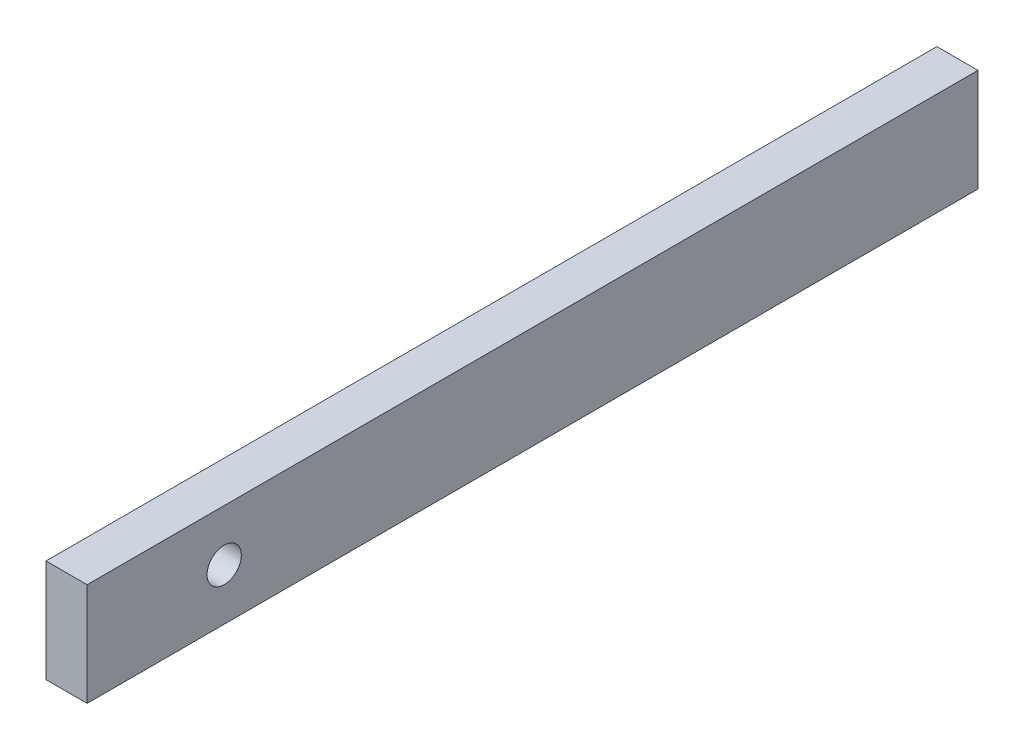
ISO-10303-21;
HEADER;
FILE_DESCRIPTION(('STEP AP214'),'2;1');
FILE_NAME('part.step','',(''),(''),'','','');
FILE_SCHEMA(('AUTOMOTIVE_DESIGN { 1 0 10303 214 1 1 1 1 }'));
ENDSEC;
DATA;
#1=APPLICATION_CONTEXT('core data for automotive mechanical design processes');
#2=APPLICATION_PROTOCOL_DEFINITION('international standard','automotive_design',2000,#1);
#3=PRODUCT_CONTEXT('',#1,'mechanical');
#4=PRODUCT('Part','Part','',(#3));
#5=PRODUCT_RELATED_PRODUCT_CATEGORY('part','',(#4));
#6=PRODUCT_DEFINITION_FORMATION('','',#4);
#7=PRODUCT_DEFINITION_CONTEXT('part definition',#1,'design');
#8=PRODUCT_DEFINITION('design','',#6,#7);
#9=PRODUCT_DEFINITION_SHAPE('','',#8);
#10=(LENGTH_UNIT() NAMED_UNIT(*) SI_UNIT(.MILLI.,.METRE.));
#11=(NAMED_UNIT(*) PLANE_ANGLE_UNIT() SI_UNIT($,.RADIAN.));
#12=(NAMED_UNIT(*) SI_UNIT($,.STERADIAN.) SOLID_ANGLE_UNIT());
#13=UNCERTAINTY_MEASURE_WITH_UNIT(LENGTH_MEASURE(1.E-05),#10,'distance_accuracy_value','');
#14=(GEOMETRIC_REPRESENTATION_CONTEXT(3) GLOBAL_UNCERTAINTY_ASSIGNED_CONTEXT((#13)) GLOBAL_UNIT_ASSIGNED_CONTEXT((#10,
#11,#12)) REPRESENTATION_CONTEXT('',''));
#15=CARTESIAN_POINT('',(0.,0.,0.));
#16=DIRECTION('',(0.,0.,1.));
#17=DIRECTION('',(1.,0.,0.));
#18=AXIS2_PLACEMENT_3D('',#15,#16,#17);
#19=CARTESIAN_POINT('',(3.,7.5,170.));
#20=DIRECTION('',(-1.,0.,0.));
#21=DIRECTION('',(0.,-1.,0.));
#22=AXIS2_PLACEMENT_3D('',#19,#20,#21);
#23=PLANE('',#22);
#24=CARTESIAN_POINT('',(3.,0.,150.));
#25=DIRECTION('',(1.,0.,0.));
#26=DIRECTION('',(0.,1.,0.));
#27=AXIS2_PLACEMENT_3D('',#24,#25,#26);
#28=CIRCLE('',#27,2.5);
#29=CARTESIAN_POINT('',(3.,2.5,150.));
#30=VERTEX_POINT('',#29);
#31=EDGE_CURVE('E97',#30,#30,#28,.T.);
#32=ORIENTED_EDGE('',*,*,#31,.F.);
#33=EDGE_LOOP('',(#32));
#34=FACE_BOUND('',#33,.T.);
#35=DIRECTION('',(0.,-1.,0.));
#36=VECTOR('',#35,1.);
#37=CARTESIAN_POINT('',(3.,7.5,40.));
#38=LINE('',#37,#36);
#39=CARTESIAN_POINT('',(3.,7.5,40.));
#40=VERTEX_POINT('',#39);
#41=CARTESIAN_POINT('',(3.,-7.5,40.));
#42=VERTEX_POINT('',#41);
#43=EDGE_CURVE('E48',#40,#42,#38,.T.);
#44=ORIENTED_EDGE('',*,*,#43,.F.);
#45=DIRECTION('',(0.,0.,-1.));
#46=VECTOR('',#45,1.);
#47=CARTESIAN_POINT('',(3.,7.5,170.));
#48=LINE('',#47,#46);
#49=CARTESIAN_POINT('',(3.,7.5,170.));
#50=VERTEX_POINT('',#49);
#51=EDGE_CURVE('E11',#50,#40,#48,.T.);
#52=ORIENTED_EDGE('',*,*,#51,.F.);
#53=DIRECTION('',(0.,1.,0.));
#54=VECTOR('',#53,1.);
#55=CARTESIAN_POINT('',(3.,7.5,170.));
#56=LINE('',#55,#54);
#57=CARTESIAN_POINT('',(3.,-7.5,170.));
#58=VERTEX_POINT('',#57);
#59=EDGE_CURVE('E92',#58,#50,#56,.T.);
#60=ORIENTED_EDGE('',*,*,#59,.F.);
#61=DIRECTION('',(0.,0.,-1.));
#62=VECTOR('',#61,1.);
#63=CARTESIAN_POINT('',(3.,-7.5,170.));
#64=LINE('',#63,#62);
#65=EDGE_CURVE('E85',#58,#42,#64,.T.);
#66=ORIENTED_EDGE('',*,*,#65,.T.);
#67=EDGE_LOOP('',(#44,#52,#60,#66));
#68=FACE_BOUND('',#67,.T.);
#69=ADVANCED_FACE('F33',(#34,#68),#23,.F.);
#70=CARTESIAN_POINT('',(-3.,7.5,170.));
#71=DIRECTION('',(0.,-1.,0.));
#72=DIRECTION('',(0.,0.,-1.));
#73=AXIS2_PLACEMENT_3D('',#70,#71,#72);
#74=PLANE('',#73);
#75=DIRECTION('',(1.,0.,0.));
#76=VECTOR('',#75,1.);
#77=CARTESIAN_POINT('',(-3.,7.5,40.));
#78=LINE('',#77,#76);
#79=CARTESIAN_POINT('',(-3.,7.5,40.));
#80=VERTEX_POINT('',#79);
#81=EDGE_CURVE('E73',#80,#40,#78,.T.);
#82=ORIENTED_EDGE('',*,*,#81,.F.);
#83=DIRECTION('',(0.,0.,-1.));
#84=VECTOR('',#83,1.);
#85=CARTESIAN_POINT('',(-3.,7.5,170.));
#86=LINE('',#85,#84);
#87=CARTESIAN_POINT('',(-3.,7.5,170.));
#88=VERTEX_POINT('',#87);
#89=EDGE_CURVE('E41',#88,#80,#86,.T.);
#90=ORIENTED_EDGE('',*,*,#89,.F.);
#91=DIRECTION('',(-1.,0.,0.));
#92=VECTOR('',#91,1.);
#93=CARTESIAN_POINT('',(-3.,7.5,170.));
#94=LINE('',#93,#92);
#95=EDGE_CURVE('E89',#50,#88,#94,.T.);
#96=ORIENTED_EDGE('',*,*,#95,.F.);
#97=ORIENTED_EDGE('',*,*,#51,.T.);
#98=EDGE_LOOP('',(#82,#90,#96,#97));
#99=FACE_BOUND('',#98,.T.);
#100=ADVANCED_FACE('F88',(#99),#74,.F.);
#101=CARTESIAN_POINT('',(-3.,7.5,170.));
#102=DIRECTION('',(1.,0.,0.));
#103=DIRECTION('',(0.,1.,0.));
#104=AXIS2_PLACEMENT_3D('',#101,#102,#103);
#105=PLANE('',#104);
#106=CARTESIAN_POINT('',(-3.,0.,150.));
#107=DIRECTION('',(1.,0.,0.));
#108=DIRECTION('',(0.,1.,0.));
#109=AXIS2_PLACEMENT_3D('',#106,#107,#108);
#110=CIRCLE('',#109,2.5);
#111=CARTESIAN_POINT('',(-3.,2.5,150.));
#112=VERTEX_POINT('',#111);
#113=EDGE_CURVE('E36',#112,#112,#110,.T.);
#114=ORIENTED_EDGE('',*,*,#113,.T.);
#115=EDGE_LOOP('',(#114));
#116=FACE_BOUND('',#115,.T.);
#117=DIRECTION('',(0.,1.,0.));
#118=VECTOR('',#117,1.);
#119=CARTESIAN_POINT('',(-3.,-7.5,40.));
#120=LINE('',#119,#118);
#121=CARTESIAN_POINT('',(-3.,-7.5,40.));
#122=VERTEX_POINT('',#121);
#123=EDGE_CURVE('E76',#122,#80,#120,.T.);
#124=ORIENTED_EDGE('',*,*,#123,.F.);
#125=DIRECTION('',(0.,0.,-1.));
#126=VECTOR('',#125,1.);
#127=CARTESIAN_POINT('',(-3.,-7.5,170.));
#128=LINE('',#127,#126);
#129=CARTESIAN_POINT('',(-3.,-7.5,170.));
#130=VERTEX_POINT('',#129);
#131=EDGE_CURVE('E104',#130,#122,#128,.T.);
#132=ORIENTED_EDGE('',*,*,#131,.F.);
#133=DIRECTION('',(0.,-1.,0.));
#134=VECTOR('',#133,1.);
#135=CARTESIAN_POINT('',(-3.,7.5,170.));
#136=LINE('',#135,#134);
#137=EDGE_CURVE('E91',#88,#130,#136,.T.);
#138=ORIENTED_EDGE('',*,*,#137,.F.);
#139=ORIENTED_EDGE('',*,*,#89,.T.);
#140=EDGE_LOOP('',(#124,#132,#138,#139));
#141=FACE_BOUND('',#140,.T.);
#142=ADVANCED_FACE('F108',(#116,#141),#105,.F.);
#143=CARTESIAN_POINT('',(-3.,-7.5,170.));
#144=DIRECTION('',(0.,1.,0.));
#145=DIRECTION('',(0.,0.,1.));
#146=AXIS2_PLACEMENT_3D('',#143,#144,#145);
#147=PLANE('',#146);
#148=DIRECTION('',(-1.,0.,0.));
#149=VECTOR('',#148,1.);
#150=CARTESIAN_POINT('',(3.,-7.5,40.));
#151=LINE('',#150,#149);
#152=EDGE_CURVE('E86',#42,#122,#151,.T.);
#153=ORIENTED_EDGE('',*,*,#152,.F.);
#154=ORIENTED_EDGE('',*,*,#65,.F.);
#155=DIRECTION('',(1.,0.,0.));
#156=VECTOR('',#155,1.);
#157=CARTESIAN_POINT('',(-3.,-7.5,170.));
#158=LINE('',#157,#156);
#159=EDGE_CURVE('E56',#130,#58,#158,.T.);
#160=ORIENTED_EDGE('',*,*,#159,.F.);
#161=ORIENTED_EDGE('',*,*,#131,.T.);
#162=EDGE_LOOP('',(#153,#154,#160,#161));
#163=FACE_BOUND('',#162,.T.);
#164=ADVANCED_FACE('F111',(#163),#147,.F.);
#165=CARTESIAN_POINT('',(0.,0.,170.));
#166=DIRECTION('',(0.,0.,1.));
#167=DIRECTION('',(1.,0.,0.));
#168=AXIS2_PLACEMENT_3D('',#165,#166,#167);
#169=PLANE('',#168);
#170=ORIENTED_EDGE('',*,*,#59,.T.);
#171=ORIENTED_EDGE('',*,*,#95,.T.);
#172=ORIENTED_EDGE('',*,*,#137,.T.);
#173=ORIENTED_EDGE('',*,*,#159,.T.);
#174=EDGE_LOOP('',(#170,#171,#172,#173));
#175=FACE_BOUND('',#174,.T.);
#176=ADVANCED_FACE('F94',(#175),#169,.T.);
#177=CARTESIAN_POINT('',(-7.,0.,150.));
#178=DIRECTION('',(1.,0.,0.));
#179=DIRECTION('',(0.,1.,0.));
#180=AXIS2_PLACEMENT_3D('',#177,#178,#179);
#181=CYLINDRICAL_SURFACE('',#180,2.5);
#182=ORIENTED_EDGE('',*,*,#31,.T.);
#183=EDGE_LOOP('',(#182));
#184=FACE_BOUND('',#183,.T.);
#185=ORIENTED_EDGE('',*,*,#113,.F.);
#186=EDGE_LOOP('',(#185));
#187=FACE_BOUND('',#186,.T.);
#188=ADVANCED_FACE('F116',(#184,#187),#181,.F.);
#189=CARTESIAN_POINT('',(0.,0.,40.));
#190=DIRECTION('',(0.,0.,-1.));
#191=DIRECTION('',(-1.,0.,0.));
#192=AXIS2_PLACEMENT_3D('',#189,#190,#191);
#193=PLANE('',#192);
#194=ORIENTED_EDGE('',*,*,#81,.T.);
#195=ORIENTED_EDGE('',*,*,#43,.T.);
#196=ORIENTED_EDGE('',*,*,#152,.T.);
#197=ORIENTED_EDGE('',*,*,#123,.T.);
#198=EDGE_LOOP('',(#194,#195,#196,#197));
#199=FACE_BOUND('',#198,.T.);
#200=ADVANCED_FACE('F74',(#199),#193,.T.);
#201=CLOSED_SHELL('',(#69,#100,#142,#164,#176,#188,#200));
#202=MANIFOLD_SOLID_BREP('B2',#201);
#203=ADVANCED_BREP_SHAPE_REPRESENTATION('',(#18,#202),#14);
#204=SHAPE_DEFINITION_REPRESENTATION(#9,#203);
ENDSEC;
END-ISO-10303-21;
